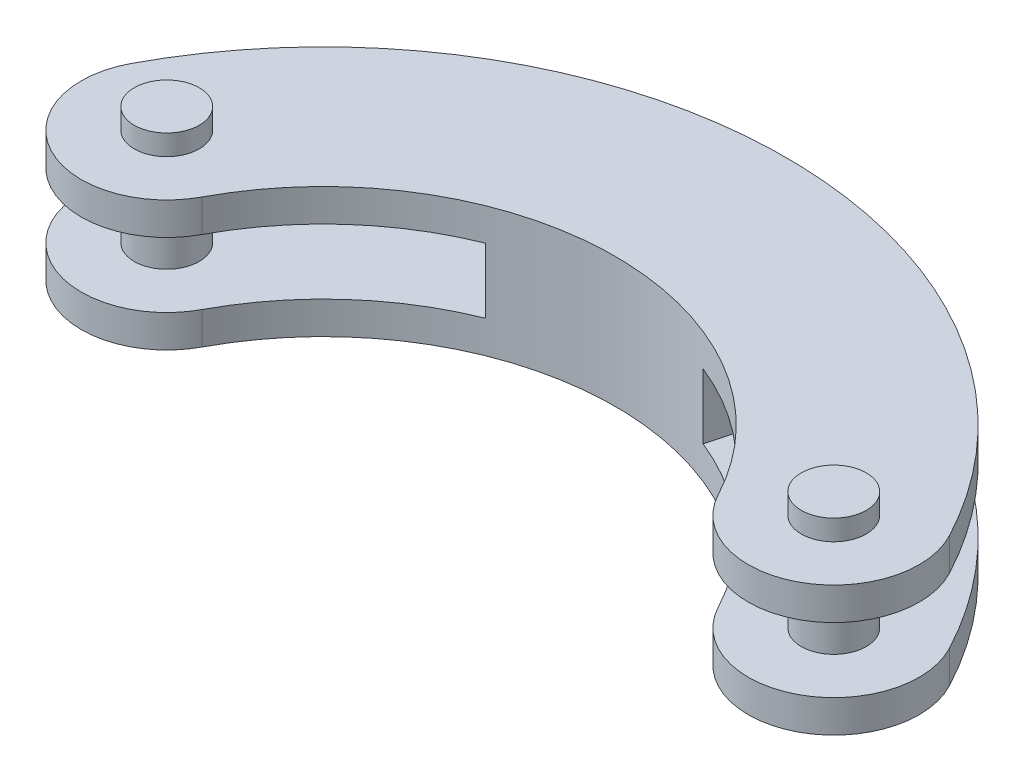
ISO-10303-21;
HEADER;
FILE_DESCRIPTION(('STEP AP214'),'2;1');
FILE_NAME('part.step','',(''),(''),'','','');
FILE_SCHEMA(('AUTOMOTIVE_DESIGN { 1 0 10303 214 1 1 1 1 }'));
ENDSEC;
DATA;
#1=APPLICATION_CONTEXT('core data for automotive mechanical design processes');
#2=APPLICATION_PROTOCOL_DEFINITION('international standard','automotive_design',2000,#1);
#3=PRODUCT_CONTEXT('',#1,'mechanical');
#4=PRODUCT('Part','Part','',(#3));
#5=PRODUCT_RELATED_PRODUCT_CATEGORY('part','',(#4));
#6=PRODUCT_DEFINITION_FORMATION('','',#4);
#7=PRODUCT_DEFINITION_CONTEXT('part definition',#1,'design');
#8=PRODUCT_DEFINITION('design','',#6,#7);
#9=PRODUCT_DEFINITION_SHAPE('','',#8);
#10=(LENGTH_UNIT() NAMED_UNIT(*) SI_UNIT(.MILLI.,.METRE.));
#11=(NAMED_UNIT(*) PLANE_ANGLE_UNIT() SI_UNIT($,.RADIAN.));
#12=(NAMED_UNIT(*) SI_UNIT($,.STERADIAN.) SOLID_ANGLE_UNIT());
#13=UNCERTAINTY_MEASURE_WITH_UNIT(LENGTH_MEASURE(1.E-05),#10,'distance_accuracy_value','');
#14=(GEOMETRIC_REPRESENTATION_CONTEXT(3) GLOBAL_UNCERTAINTY_ASSIGNED_CONTEXT((#13)) GLOBAL_UNIT_ASSIGNED_CONTEXT((#10,
#11,#12)) REPRESENTATION_CONTEXT('',''));
#15=CARTESIAN_POINT('',(0.,0.,0.));
#16=DIRECTION('',(0.,0.,1.));
#17=DIRECTION('',(1.,0.,0.));
#18=AXIS2_PLACEMENT_3D('',#15,#16,#17);
#19=CARTESIAN_POINT('',(48.75,9.5,84.5068861385762));
#20=DIRECTION('',(0.,1.,0.));
#21=DIRECTION('',(0.,0.,1.));
#22=AXIS2_PLACEMENT_3D('',#19,#20,#21);
#23=PLANE('',#22);
#24=CARTESIAN_POINT('',(-97.5,9.5,58.6208369333043));
#25=DIRECTION('',(0.,1.,0.));
#26=DIRECTION('',(0.,0.,1.));
#27=AXIS2_PLACEMENT_3D('',#24,#25,#26);
#28=CIRCLE('',#27,9.5);
#29=CARTESIAN_POINT('',(-97.5,9.5,68.1208369333043));
#30=VERTEX_POINT('',#29);
#31=EDGE_CURVE('E279',#30,#30,#28,.T.);
#32=ORIENTED_EDGE('',*,*,#31,.F.);
#33=EDGE_LOOP('',(#32));
#34=FACE_BOUND('',#33,.T.);
#35=CARTESIAN_POINT('',(0.,9.5,110.392935343848));
#36=DIRECTION('',(0.,-1.,0.));
#37=DIRECTION('',(0.,0.,1.));
#38=AXIS2_PLACEMENT_3D('',#35,#36,#37);
#39=CIRCLE('',#38,85.3929353438482);
#40=CARTESIAN_POINT('',(-75.4197827070386,9.5,70.3453413704057));
#41=VERTEX_POINT('',#40);
#42=CARTESIAN_POINT('',(-31.8432552720584,9.5,31.1593534462894));
#43=VERTEX_POINT('',#42);
#44=EDGE_CURVE('E60',#41,#43,#39,.T.);
#45=ORIENTED_EDGE('',*,*,#44,.T.);
#46=DIRECTION('',(-0.258819045102515,0.,-0.96592582628907));
#47=VECTOR('',#46,1.);
#48=CARTESIAN_POINT('',(-44.1456613988408,9.5,-14.7538512742104));
#49=LINE('',#48,#47);
#50=CARTESIAN_POINT('',(-44.8434517439362,9.5,-17.3580402951375));
#51=VERTEX_POINT('',#50);
#52=EDGE_CURVE('E153',#43,#51,#49,.T.);
#53=ORIENTED_EDGE('',*,*,#52,.T.);
#54=CARTESIAN_POINT('',(0.,9.5,110.392935343848));
#55=DIRECTION('',(0.,1.,0.));
#56=DIRECTION('',(0.,0.,1.));
#57=AXIS2_PLACEMENT_3D('',#54,#55,#56);
#58=CIRCLE('',#57,135.392935343848);
#59=CARTESIAN_POINT('',(-119.580217292961,9.5,46.8963324962029));
#60=VERTEX_POINT('',#59);
#61=EDGE_CURVE('E224',#51,#60,#58,.T.);
#62=ORIENTED_EDGE('',*,*,#61,.T.);
#63=CARTESIAN_POINT('',(-97.5,9.5,58.6208369333043));
#64=DIRECTION('',(0.,1.,0.));
#65=DIRECTION('',(0.,0.,1.));
#66=AXIS2_PLACEMENT_3D('',#63,#64,#65);
#67=CIRCLE('',#66,25.);
#68=EDGE_CURVE('E230',#60,#41,#67,.T.);
#69=ORIENTED_EDGE('',*,*,#68,.T.);
#70=EDGE_LOOP('',(#45,#53,#62,#69));
#71=FACE_BOUND('',#70,.T.);
#72=ADVANCED_FACE('F34',(#34,#71),#23,.T.);
#73=CARTESIAN_POINT('',(97.5,9.5,58.6208369333043));
#74=DIRECTION('',(0.,-1.,0.));
#75=DIRECTION('',(0.,0.,-1.));
#76=AXIS2_PLACEMENT_3D('',#73,#74,#75);
#77=CYLINDRICAL_SURFACE('',#76,25.);
#78=CARTESIAN_POINT('',(97.5,0.,58.6208369333043));
#79=DIRECTION('',(0.,1.,0.));
#80=DIRECTION('',(0.,0.,1.));
#81=AXIS2_PLACEMENT_3D('',#78,#79,#80);
#82=CIRCLE('',#81,25.);
#83=CARTESIAN_POINT('',(75.4197827070387,0.,70.3453413704057));
#84=VERTEX_POINT('',#83);
#85=CARTESIAN_POINT('',(119.580217292961,0.,46.8963324962029));
#86=VERTEX_POINT('',#85);
#87=EDGE_CURVE('E215',#84,#86,#82,.T.);
#88=ORIENTED_EDGE('',*,*,#87,.T.);
#89=DIRECTION('',(0.,-1.,0.));
#90=VECTOR('',#89,1.);
#91=CARTESIAN_POINT('',(119.580217292961,9.5,46.8963324962029));
#92=LINE('',#91,#90);
#93=CARTESIAN_POINT('',(119.580217292961,9.5,46.8963324962029));
#94=VERTEX_POINT('',#93);
#95=EDGE_CURVE('E11',#94,#86,#92,.T.);
#96=ORIENTED_EDGE('',*,*,#95,.F.);
#97=CARTESIAN_POINT('',(97.5,9.5,58.6208369333043));
#98=DIRECTION('',(0.,1.,0.));
#99=DIRECTION('',(0.,0.,1.));
#100=AXIS2_PLACEMENT_3D('',#97,#98,#99);
#101=CIRCLE('',#100,25.);
#102=CARTESIAN_POINT('',(75.4197827070387,9.5,70.3453413704057));
#103=VERTEX_POINT('',#102);
#104=EDGE_CURVE('E228',#103,#94,#101,.T.);
#105=ORIENTED_EDGE('',*,*,#104,.F.);
#106=DIRECTION('',(0.,-1.,0.));
#107=VECTOR('',#106,1.);
#108=CARTESIAN_POINT('',(75.4197827070387,9.5,70.3453413704057));
#109=LINE('',#108,#107);
#110=EDGE_CURVE('E248',#103,#84,#109,.T.);
#111=ORIENTED_EDGE('',*,*,#110,.T.);
#112=EDGE_LOOP('',(#88,#96,#105,#111));
#113=FACE_BOUND('',#112,.T.);
#114=ADVANCED_FACE('F36',(#113),#77,.T.);
#115=CARTESIAN_POINT('',(0.,9.5,110.392935343848));
#116=DIRECTION('',(0.,-1.,0.));
#117=DIRECTION('',(0.,0.,-1.));
#118=AXIS2_PLACEMENT_3D('',#115,#116,#117);
#119=CYLINDRICAL_SURFACE('',#118,135.392935343848);
#120=CARTESIAN_POINT('',(0.,0.,110.392935343848));
#121=DIRECTION('',(0.,1.,0.));
#122=DIRECTION('',(0.,0.,1.));
#123=AXIS2_PLACEMENT_3D('',#120,#121,#122);
#124=CIRCLE('',#123,135.392935343848);
#125=CARTESIAN_POINT('',(-119.580217292961,0.,46.8963324962029));
#126=VERTEX_POINT('',#125);
#127=EDGE_CURVE('E243',#86,#126,#124,.T.);
#128=ORIENTED_EDGE('',*,*,#127,.T.);
#129=DIRECTION('',(0.,-1.,0.));
#130=VECTOR('',#129,1.);
#131=CARTESIAN_POINT('',(-119.580217292961,9.5,46.8963324962029));
#132=LINE('',#131,#130);
#133=EDGE_CURVE('E44',#60,#126,#132,.T.);
#134=ORIENTED_EDGE('',*,*,#133,.F.);
#135=ORIENTED_EDGE('',*,*,#61,.F.);
#136=DIRECTION('',(0.,-1.,0.));
#137=VECTOR('',#136,1.);
#138=CARTESIAN_POINT('',(-44.8434517439362,28.5,-17.3580402951375));
#139=LINE('',#138,#137);
#140=CARTESIAN_POINT('',(-44.8434517439362,28.5,-17.3580402951375));
#141=VERTEX_POINT('',#140);
#142=EDGE_CURVE('E188',#141,#51,#139,.T.);
#143=ORIENTED_EDGE('',*,*,#142,.F.);
#144=CARTESIAN_POINT('',(0.,28.5,110.392935343848));
#145=DIRECTION('',(0.,1.,0.));
#146=DIRECTION('',(0.,0.,1.));
#147=AXIS2_PLACEMENT_3D('',#144,#145,#146);
#148=CIRCLE('',#147,135.392935343848);
#149=CARTESIAN_POINT('',(-119.580217292961,28.5,46.8963324962029));
#150=VERTEX_POINT('',#149);
#151=EDGE_CURVE('E183',#141,#150,#148,.T.);
#152=ORIENTED_EDGE('',*,*,#151,.T.);
#153=DIRECTION('',(0.,-1.,0.));
#154=VECTOR('',#153,1.);
#155=CARTESIAN_POINT('',(-119.580217292961,38.,46.8963324962029));
#156=LINE('',#155,#154);
#157=CARTESIAN_POINT('',(-119.580217292961,38.,46.8963324962029));
#158=VERTEX_POINT('',#157);
#159=EDGE_CURVE('E134',#158,#150,#156,.T.);
#160=ORIENTED_EDGE('',*,*,#159,.F.);
#161=CARTESIAN_POINT('',(0.,38.,110.392935343848));
#162=DIRECTION('',(0.,1.,0.));
#163=DIRECTION('',(0.,0.,1.));
#164=AXIS2_PLACEMENT_3D('',#161,#162,#163);
#165=CIRCLE('',#164,135.392935343848);
#166=CARTESIAN_POINT('',(119.580217292961,38.,46.8963324962029));
#167=VERTEX_POINT('',#166);
#168=EDGE_CURVE('E126',#167,#158,#165,.T.);
#169=ORIENTED_EDGE('',*,*,#168,.F.);
#170=DIRECTION('',(0.,-1.,0.));
#171=VECTOR('',#170,1.);
#172=CARTESIAN_POINT('',(119.580217292961,38.,46.8963324962029));
#173=LINE('',#172,#171);
#174=CARTESIAN_POINT('',(119.580217292961,28.5,46.8963324962029));
#175=VERTEX_POINT('',#174);
#176=EDGE_CURVE('E131',#167,#175,#173,.T.);
#177=ORIENTED_EDGE('',*,*,#176,.T.);
#178=CARTESIAN_POINT('',(44.8434517439363,28.5,-17.3580402951375));
#179=VERTEX_POINT('',#178);
#180=EDGE_CURVE('E274',#175,#179,#148,.T.);
#181=ORIENTED_EDGE('',*,*,#180,.T.);
#182=DIRECTION('',(0.,-1.,0.));
#183=VECTOR('',#182,1.);
#184=CARTESIAN_POINT('',(44.8434517439363,28.5,-17.3580402951375));
#185=LINE('',#184,#183);
#186=CARTESIAN_POINT('',(44.8434517439363,9.5,-17.3580402951375));
#187=VERTEX_POINT('',#186);
#188=EDGE_CURVE('E207',#179,#187,#185,.T.);
#189=ORIENTED_EDGE('',*,*,#188,.T.);
#190=EDGE_CURVE('E227',#94,#187,#58,.T.);
#191=ORIENTED_EDGE('',*,*,#190,.F.);
#192=ORIENTED_EDGE('',*,*,#95,.T.);
#193=EDGE_LOOP('',(#128,#134,#135,#143,#152,#160,#169,#177,#181,#189,#191,#192));
#194=FACE_BOUND('',#193,.T.);
#195=ADVANCED_FACE('F128',(#194),#119,.T.);
#196=CARTESIAN_POINT('',(-97.5,9.5,58.6208369333043));
#197=DIRECTION('',(0.,-1.,0.));
#198=DIRECTION('',(0.,0.,-1.));
#199=AXIS2_PLACEMENT_3D('',#196,#197,#198);
#200=CYLINDRICAL_SURFACE('',#199,25.);
#201=CARTESIAN_POINT('',(-97.5,0.,58.6208369333043));
#202=DIRECTION('',(0.,1.,0.));
#203=DIRECTION('',(0.,0.,1.));
#204=AXIS2_PLACEMENT_3D('',#201,#202,#203);
#205=CIRCLE('',#204,25.);
#206=CARTESIAN_POINT('',(-75.4197827070386,0.,70.3453413704057));
#207=VERTEX_POINT('',#206);
#208=EDGE_CURVE('E245',#126,#207,#205,.T.);
#209=ORIENTED_EDGE('',*,*,#208,.T.);
#210=DIRECTION('',(0.,-1.,0.));
#211=VECTOR('',#210,1.);
#212=CARTESIAN_POINT('',(-75.4197827070386,9.5,70.3453413704057));
#213=LINE('',#212,#211);
#214=EDGE_CURVE('E251',#41,#207,#213,.T.);
#215=ORIENTED_EDGE('',*,*,#214,.F.);
#216=ORIENTED_EDGE('',*,*,#68,.F.);
#217=ORIENTED_EDGE('',*,*,#133,.T.);
#218=EDGE_LOOP('',(#209,#215,#216,#217));
#219=FACE_BOUND('',#218,.T.);
#220=ADVANCED_FACE('F256',(#219),#200,.T.);
#221=CARTESIAN_POINT('',(0.,9.5,110.392935343848));
#222=DIRECTION('',(0.,-1.,0.));
#223=DIRECTION('',(0.,0.,-1.));
#224=AXIS2_PLACEMENT_3D('',#221,#222,#223);
#225=CYLINDRICAL_SURFACE('',#224,85.3929353438482);
#226=CARTESIAN_POINT('',(0.,0.,110.392935343848));
#227=DIRECTION('',(0.,-1.,0.));
#228=DIRECTION('',(0.,0.,1.));
#229=AXIS2_PLACEMENT_3D('',#226,#227,#228);
#230=CIRCLE('',#229,85.3929353438482);
#231=EDGE_CURVE('E233',#207,#84,#230,.T.);
#232=ORIENTED_EDGE('',*,*,#231,.T.);
#233=ORIENTED_EDGE('',*,*,#110,.F.);
#234=CARTESIAN_POINT('',(31.8432552720585,9.5,31.1593534462894));
#235=VERTEX_POINT('',#234);
#236=EDGE_CURVE('E204',#235,#103,#39,.T.);
#237=ORIENTED_EDGE('',*,*,#236,.F.);
#238=DIRECTION('',(0.,-1.,0.));
#239=VECTOR('',#238,1.);
#240=CARTESIAN_POINT('',(31.8432552720585,28.5,31.1593534462894));
#241=LINE('',#240,#239);
#242=CARTESIAN_POINT('',(31.8432552720585,28.5,31.1593534462894));
#243=VERTEX_POINT('',#242);
#244=EDGE_CURVE('E210',#243,#235,#241,.T.);
#245=ORIENTED_EDGE('',*,*,#244,.F.);
#246=CARTESIAN_POINT('',(0.,28.5,110.392935343848));
#247=DIRECTION('',(0.,-1.,0.));
#248=DIRECTION('',(0.,0.,1.));
#249=AXIS2_PLACEMENT_3D('',#246,#247,#248);
#250=CIRCLE('',#249,85.3929353438482);
#251=CARTESIAN_POINT('',(75.4197827070387,28.5,70.3453413704057));
#252=VERTEX_POINT('',#251);
#253=EDGE_CURVE('E162',#243,#252,#250,.T.);
#254=ORIENTED_EDGE('',*,*,#253,.T.);
#255=DIRECTION('',(0.,-1.,0.));
#256=VECTOR('',#255,1.);
#257=CARTESIAN_POINT('',(75.4197827070387,38.,70.3453413704057));
#258=LINE('',#257,#256);
#259=CARTESIAN_POINT('',(75.4197827070387,38.,70.3453413704057));
#260=VERTEX_POINT('',#259);
#261=EDGE_CURVE('E169',#260,#252,#258,.T.);
#262=ORIENTED_EDGE('',*,*,#261,.F.);
#263=CARTESIAN_POINT('',(0.,38.,110.392935343848));
#264=DIRECTION('',(0.,-1.,0.));
#265=DIRECTION('',(0.,0.,1.));
#266=AXIS2_PLACEMENT_3D('',#263,#264,#265);
#267=CIRCLE('',#266,85.3929353438482);
#268=CARTESIAN_POINT('',(-75.4197827070386,38.,70.3453413704057));
#269=VERTEX_POINT('',#268);
#270=EDGE_CURVE('E143',#269,#260,#267,.T.);
#271=ORIENTED_EDGE('',*,*,#270,.F.);
#272=DIRECTION('',(0.,-1.,0.));
#273=VECTOR('',#272,1.);
#274=CARTESIAN_POINT('',(-75.4197827070386,38.,70.3453413704057));
#275=LINE('',#274,#273);
#276=CARTESIAN_POINT('',(-75.4197827070386,28.5,70.3453413704057));
#277=VERTEX_POINT('',#276);
#278=EDGE_CURVE('E155',#269,#277,#275,.T.);
#279=ORIENTED_EDGE('',*,*,#278,.T.);
#280=CARTESIAN_POINT('',(-31.8432552720584,28.5,31.1593534462894));
#281=VERTEX_POINT('',#280);
#282=EDGE_CURVE('E147',#277,#281,#250,.T.);
#283=ORIENTED_EDGE('',*,*,#282,.T.);
#284=DIRECTION('',(0.,-1.,0.));
#285=VECTOR('',#284,1.);
#286=CARTESIAN_POINT('',(-31.8432552720584,28.5,31.1593534462894));
#287=LINE('',#286,#285);
#288=EDGE_CURVE('E187',#281,#43,#287,.T.);
#289=ORIENTED_EDGE('',*,*,#288,.T.);
#290=ORIENTED_EDGE('',*,*,#44,.F.);
#291=ORIENTED_EDGE('',*,*,#214,.T.);
#292=EDGE_LOOP('',(#232,#233,#237,#245,#254,#262,#271,#279,#283,#289,#290,#291));
#293=FACE_BOUND('',#292,.T.);
#294=ADVANCED_FACE('F175',(#293),#225,.F.);
#295=CARTESIAN_POINT('',(97.5,9.5,58.6208369333043));
#296=DIRECTION('',(0.,1.,0.));
#297=DIRECTION('',(0.,0.,1.));
#298=AXIS2_PLACEMENT_3D('',#295,#296,#297);
#299=CIRCLE('',#298,9.5);
#300=CARTESIAN_POINT('',(97.5,9.5,68.1208369333043));
#301=VERTEX_POINT('',#300);
#302=EDGE_CURVE('E287',#301,#301,#299,.T.);
#303=ORIENTED_EDGE('',*,*,#302,.F.);
#304=EDGE_LOOP('',(#303));
#305=FACE_BOUND('',#304,.T.);
#306=DIRECTION('',(0.258819045102514,0.,-0.96592582628907));
#307=VECTOR('',#306,1.);
#308=CARTESIAN_POINT('',(16.1991293678318,9.5,89.5440261608693));
#309=LINE('',#308,#307);
#310=EDGE_CURVE('E52',#235,#187,#309,.T.);
#311=ORIENTED_EDGE('',*,*,#310,.F.);
#312=ORIENTED_EDGE('',*,*,#236,.T.);
#313=ORIENTED_EDGE('',*,*,#104,.T.);
#314=ORIENTED_EDGE('',*,*,#190,.T.);
#315=EDGE_LOOP('',(#311,#312,#313,#314));
#316=FACE_BOUND('',#315,.T.);
#317=ADVANCED_FACE('F266',(#305,#316),#23,.T.);
#318=CARTESIAN_POINT('',(48.75,0.,84.5068861385762));
#319=DIRECTION('',(0.,1.,0.));
#320=DIRECTION('',(0.,0.,1.));
#321=AXIS2_PLACEMENT_3D('',#318,#319,#320);
#322=PLANE('',#321);
#323=CARTESIAN_POINT('',(97.5,0.,58.6208369333043));
#324=DIRECTION('',(0.,1.,0.));
#325=DIRECTION('',(0.,0.,1.));
#326=AXIS2_PLACEMENT_3D('',#323,#324,#325);
#327=CIRCLE('',#326,9.5);
#328=CARTESIAN_POINT('',(97.5,0.,68.1208369333043));
#329=VERTEX_POINT('',#328);
#330=EDGE_CURVE('E303',#329,#329,#327,.T.);
#331=ORIENTED_EDGE('',*,*,#330,.T.);
#332=EDGE_LOOP('',(#331));
#333=FACE_BOUND('',#332,.T.);
#334=CARTESIAN_POINT('',(-97.5,0.,58.6208369333043));
#335=DIRECTION('',(0.,1.,0.));
#336=DIRECTION('',(0.,0.,1.));
#337=AXIS2_PLACEMENT_3D('',#334,#335,#336);
#338=CIRCLE('',#337,9.5);
#339=CARTESIAN_POINT('',(-97.5,0.,68.1208369333043));
#340=VERTEX_POINT('',#339);
#341=EDGE_CURVE('E293',#340,#340,#338,.T.);
#342=ORIENTED_EDGE('',*,*,#341,.T.);
#343=EDGE_LOOP('',(#342));
#344=FACE_BOUND('',#343,.T.);
#345=ORIENTED_EDGE('',*,*,#87,.F.);
#346=ORIENTED_EDGE('',*,*,#231,.F.);
#347=ORIENTED_EDGE('',*,*,#208,.F.);
#348=ORIENTED_EDGE('',*,*,#127,.F.);
#349=EDGE_LOOP('',(#345,#346,#347,#348));
#350=FACE_BOUND('',#349,.T.);
#351=ADVANCED_FACE('F261',(#333,#344,#350),#322,.F.);
#352=CARTESIAN_POINT('',(16.1991293678318,28.5,89.5440261608693));
#353=DIRECTION('',(-0.96592582628907,0.,-0.258819045102514));
#354=DIRECTION('',(-0.258819045102514,0.,0.96592582628907));
#355=AXIS2_PLACEMENT_3D('',#352,#353,#354);
#356=PLANE('',#355);
#357=ORIENTED_EDGE('',*,*,#310,.T.);
#358=ORIENTED_EDGE('',*,*,#188,.F.);
#359=DIRECTION('',(0.258819045102514,0.,-0.96592582628907));
#360=VECTOR('',#359,1.);
#361=CARTESIAN_POINT('',(16.1991293678318,28.5,89.5440261608693));
#362=LINE('',#361,#360);
#363=EDGE_CURVE('E38',#243,#179,#362,.T.);
#364=ORIENTED_EDGE('',*,*,#363,.F.);
#365=ORIENTED_EDGE('',*,*,#244,.T.);
#366=EDGE_LOOP('',(#357,#358,#364,#365));
#367=FACE_BOUND('',#366,.T.);
#368=ADVANCED_FACE('F270',(#367),#356,.F.);
#369=CARTESIAN_POINT('',(-44.1456613988408,28.5,-14.7538512742104));
#370=DIRECTION('',(-0.96592582628907,0.,0.258819045102515));
#371=DIRECTION('',(0.258819045102515,0.,0.96592582628907));
#372=AXIS2_PLACEMENT_3D('',#369,#370,#371);
#373=PLANE('',#372);
#374=ORIENTED_EDGE('',*,*,#52,.F.);
#375=ORIENTED_EDGE('',*,*,#288,.F.);
#376=DIRECTION('',(-0.258819045102515,0.,-0.96592582628907));
#377=VECTOR('',#376,1.);
#378=CARTESIAN_POINT('',(-44.1456613988408,28.5,-14.7538512742104));
#379=LINE('',#378,#377);
#380=EDGE_CURVE('E182',#281,#141,#379,.T.);
#381=ORIENTED_EDGE('',*,*,#380,.T.);
#382=ORIENTED_EDGE('',*,*,#142,.T.);
#383=EDGE_LOOP('',(#374,#375,#381,#382));
#384=FACE_BOUND('',#383,.T.);
#385=ADVANCED_FACE('F221',(#384),#373,.T.);
#386=CARTESIAN_POINT('',(48.75,28.5,84.5068861385762));
#387=DIRECTION('',(0.,1.,0.));
#388=DIRECTION('',(0.,0.,1.));
#389=AXIS2_PLACEMENT_3D('',#386,#387,#388);
#390=PLANE('',#389);
#391=CARTESIAN_POINT('',(97.5,28.5,58.6208369333043));
#392=DIRECTION('',(0.,1.,0.));
#393=DIRECTION('',(0.,0.,1.));
#394=AXIS2_PLACEMENT_3D('',#391,#392,#393);
#395=CIRCLE('',#394,9.5);
#396=CARTESIAN_POINT('',(97.5,28.5,68.1208369333043));
#397=VERTEX_POINT('',#396);
#398=EDGE_CURVE('E308',#397,#397,#395,.T.);
#399=ORIENTED_EDGE('',*,*,#398,.T.);
#400=EDGE_LOOP('',(#399));
#401=FACE_BOUND('',#400,.T.);
#402=ORIENTED_EDGE('',*,*,#253,.F.);
#403=ORIENTED_EDGE('',*,*,#363,.T.);
#404=ORIENTED_EDGE('',*,*,#180,.F.);
#405=CARTESIAN_POINT('',(97.5,28.5,58.6208369333043));
#406=DIRECTION('',(0.,1.,0.));
#407=DIRECTION('',(0.,0.,1.));
#408=AXIS2_PLACEMENT_3D('',#405,#406,#407);
#409=CIRCLE('',#408,25.);
#410=EDGE_CURVE('E151',#252,#175,#409,.T.);
#411=ORIENTED_EDGE('',*,*,#410,.F.);
#412=EDGE_LOOP('',(#402,#403,#404,#411));
#413=FACE_BOUND('',#412,.T.);
#414=ADVANCED_FACE('F273',(#401,#413),#390,.F.);
#415=CARTESIAN_POINT('',(97.5,38.,58.6208369333043));
#416=DIRECTION('',(0.,-1.,0.));
#417=DIRECTION('',(0.,0.,-1.));
#418=AXIS2_PLACEMENT_3D('',#415,#416,#417);
#419=CYLINDRICAL_SURFACE('',#418,25.);
#420=ORIENTED_EDGE('',*,*,#410,.T.);
#421=ORIENTED_EDGE('',*,*,#176,.F.);
#422=CARTESIAN_POINT('',(97.5,38.,58.6208369333043));
#423=DIRECTION('',(0.,1.,0.));
#424=DIRECTION('',(0.,0.,1.));
#425=AXIS2_PLACEMENT_3D('',#422,#423,#424);
#426=CIRCLE('',#425,25.);
#427=EDGE_CURVE('E138',#260,#167,#426,.T.);
#428=ORIENTED_EDGE('',*,*,#427,.F.);
#429=ORIENTED_EDGE('',*,*,#261,.T.);
#430=EDGE_LOOP('',(#420,#421,#428,#429));
#431=FACE_BOUND('',#430,.T.);
#432=ADVANCED_FACE('F149',(#431),#419,.T.);
#433=CARTESIAN_POINT('',(-97.5,38.,58.6208369333043));
#434=DIRECTION('',(0.,-1.,0.));
#435=DIRECTION('',(0.,0.,-1.));
#436=AXIS2_PLACEMENT_3D('',#433,#434,#435);
#437=CYLINDRICAL_SURFACE('',#436,25.);
#438=CARTESIAN_POINT('',(-97.5,28.5,58.6208369333043));
#439=DIRECTION('',(0.,1.,0.));
#440=DIRECTION('',(0.,0.,1.));
#441=AXIS2_PLACEMENT_3D('',#438,#439,#440);
#442=CIRCLE('',#441,25.);
#443=EDGE_CURVE('E167',#150,#277,#442,.T.);
#444=ORIENTED_EDGE('',*,*,#443,.T.);
#445=ORIENTED_EDGE('',*,*,#278,.F.);
#446=CARTESIAN_POINT('',(-97.5,38.,58.6208369333043));
#447=DIRECTION('',(0.,1.,0.));
#448=DIRECTION('',(0.,0.,1.));
#449=AXIS2_PLACEMENT_3D('',#446,#447,#448);
#450=CIRCLE('',#449,25.);
#451=EDGE_CURVE('E137',#158,#269,#450,.T.);
#452=ORIENTED_EDGE('',*,*,#451,.F.);
#453=ORIENTED_EDGE('',*,*,#159,.T.);
#454=EDGE_LOOP('',(#444,#445,#452,#453));
#455=FACE_BOUND('',#454,.T.);
#456=ADVANCED_FACE('F360',(#455),#437,.T.);
#457=CARTESIAN_POINT('',(48.75,38.,84.5068861385762));
#458=DIRECTION('',(0.,1.,0.));
#459=DIRECTION('',(0.,0.,1.));
#460=AXIS2_PLACEMENT_3D('',#457,#458,#459);
#461=PLANE('',#460);
#462=CARTESIAN_POINT('',(97.5,38.,58.6208369333043));
#463=DIRECTION('',(0.,1.,0.));
#464=DIRECTION('',(0.,0.,1.));
#465=AXIS2_PLACEMENT_3D('',#462,#463,#464);
#466=CIRCLE('',#465,9.5);
#467=CARTESIAN_POINT('',(97.5,38.,68.1208369333043));
#468=VERTEX_POINT('',#467);
#469=EDGE_CURVE('E290',#468,#468,#466,.T.);
#470=ORIENTED_EDGE('',*,*,#469,.F.);
#471=EDGE_LOOP('',(#470));
#472=FACE_BOUND('',#471,.T.);
#473=CARTESIAN_POINT('',(-97.5,38.,58.6208369333043));
#474=DIRECTION('',(0.,1.,0.));
#475=DIRECTION('',(0.,0.,1.));
#476=AXIS2_PLACEMENT_3D('',#473,#474,#475);
#477=CIRCLE('',#476,9.5);
#478=CARTESIAN_POINT('',(-97.5,38.,68.1208369333043));
#479=VERTEX_POINT('',#478);
#480=EDGE_CURVE('E284',#479,#479,#477,.T.);
#481=ORIENTED_EDGE('',*,*,#480,.F.);
#482=EDGE_LOOP('',(#481));
#483=FACE_BOUND('',#482,.T.);
#484=ORIENTED_EDGE('',*,*,#427,.T.);
#485=ORIENTED_EDGE('',*,*,#168,.T.);
#486=ORIENTED_EDGE('',*,*,#451,.T.);
#487=ORIENTED_EDGE('',*,*,#270,.T.);
#488=EDGE_LOOP('',(#484,#485,#486,#487));
#489=FACE_BOUND('',#488,.T.);
#490=ADVANCED_FACE('F141',(#472,#483,#489),#461,.T.);
#491=CARTESIAN_POINT('',(-97.5,28.5,58.6208369333043));
#492=DIRECTION('',(0.,1.,0.));
#493=DIRECTION('',(0.,0.,1.));
#494=AXIS2_PLACEMENT_3D('',#491,#492,#493);
#495=CIRCLE('',#494,9.5);
#496=CARTESIAN_POINT('',(-97.5,28.5,68.1208369333043));
#497=VERTEX_POINT('',#496);
#498=EDGE_CURVE('E296',#497,#497,#495,.T.);
#499=ORIENTED_EDGE('',*,*,#498,.T.);
#500=EDGE_LOOP('',(#499));
#501=FACE_BOUND('',#500,.T.);
#502=ORIENTED_EDGE('',*,*,#380,.F.);
#503=ORIENTED_EDGE('',*,*,#282,.F.);
#504=ORIENTED_EDGE('',*,*,#443,.F.);
#505=ORIENTED_EDGE('',*,*,#151,.F.);
#506=EDGE_LOOP('',(#502,#503,#504,#505));
#507=FACE_BOUND('',#506,.T.);
#508=ADVANCED_FACE('F180',(#501,#507),#390,.F.);
#509=CARTESIAN_POINT('',(-97.5,-6.00000000000001,58.6208369333043));
#510=DIRECTION('',(0.,1.,0.));
#511=DIRECTION('',(0.,0.,1.));
#512=AXIS2_PLACEMENT_3D('',#509,#510,#511);
#513=CYLINDRICAL_SURFACE('',#512,9.5);
#514=ORIENTED_EDGE('',*,*,#31,.T.);
#515=EDGE_LOOP('',(#514));
#516=FACE_BOUND('',#515,.T.);
#517=ORIENTED_EDGE('',*,*,#498,.F.);
#518=EDGE_LOOP('',(#517));
#519=FACE_BOUND('',#518,.T.);
#520=ADVANCED_FACE('F366',(#516,#519),#513,.T.);
#521=CARTESIAN_POINT('',(-97.5,44.,58.6208369333043));
#522=DIRECTION('',(0.,1.,0.));
#523=DIRECTION('',(0.,0.,1.));
#524=AXIS2_PLACEMENT_3D('',#521,#522,#523);
#525=PLANE('',#524);
#526=CARTESIAN_POINT('',(-97.5,44.,58.6208369333043));
#527=DIRECTION('',(0.,1.,0.));
#528=DIRECTION('',(0.,0.,1.));
#529=AXIS2_PLACEMENT_3D('',#526,#527,#528);
#530=CIRCLE('',#529,9.5);
#531=CARTESIAN_POINT('',(-97.5,44.,68.1208369333043));
#532=VERTEX_POINT('',#531);
#533=EDGE_CURVE('E300',#532,#532,#530,.T.);
#534=ORIENTED_EDGE('',*,*,#533,.T.);
#535=EDGE_LOOP('',(#534));
#536=FACE_BOUND('',#535,.T.);
#537=ADVANCED_FACE('F372',(#536),#525,.T.);
#538=ORIENTED_EDGE('',*,*,#480,.T.);
#539=EDGE_LOOP('',(#538));
#540=FACE_BOUND('',#539,.T.);
#541=ORIENTED_EDGE('',*,*,#533,.F.);
#542=EDGE_LOOP('',(#541));
#543=FACE_BOUND('',#542,.T.);
#544=ADVANCED_FACE('F375',(#540,#543),#513,.T.);
#545=CARTESIAN_POINT('',(-97.5,-6.00000000000001,58.6208369333043));
#546=DIRECTION('',(0.,1.,0.));
#547=DIRECTION('',(0.,0.,1.));
#548=AXIS2_PLACEMENT_3D('',#545,#546,#547);
#549=CIRCLE('',#548,9.5);
#550=CARTESIAN_POINT('',(-97.5,-6.00000000000001,68.1208369333043));
#551=VERTEX_POINT('',#550);
#552=EDGE_CURVE('E299',#551,#551,#549,.T.);
#553=ORIENTED_EDGE('',*,*,#552,.T.);
#554=EDGE_LOOP('',(#553));
#555=FACE_BOUND('',#554,.T.);
#556=ORIENTED_EDGE('',*,*,#341,.F.);
#557=EDGE_LOOP('',(#556));
#558=FACE_BOUND('',#557,.T.);
#559=ADVANCED_FACE('F376',(#555,#558),#513,.T.);
#560=CARTESIAN_POINT('',(-97.5,-6.00000000000001,58.6208369333043));
#561=DIRECTION('',(0.,1.,0.));
#562=DIRECTION('',(0.,0.,1.));
#563=AXIS2_PLACEMENT_3D('',#560,#561,#562);
#564=PLANE('',#563);
#565=ORIENTED_EDGE('',*,*,#552,.F.);
#566=EDGE_LOOP('',(#565));
#567=FACE_BOUND('',#566,.T.);
#568=ADVANCED_FACE('F391',(#567),#564,.F.);
#569=CARTESIAN_POINT('',(97.5,44.,58.6208369333043));
#570=DIRECTION('',(0.,1.,0.));
#571=DIRECTION('',(0.,0.,1.));
#572=AXIS2_PLACEMENT_3D('',#569,#570,#571);
#573=PLANE('',#572);
#574=CARTESIAN_POINT('',(97.5,44.,58.6208369333043));
#575=DIRECTION('',(0.,1.,0.));
#576=DIRECTION('',(0.,0.,1.));
#577=AXIS2_PLACEMENT_3D('',#574,#575,#576);
#578=CIRCLE('',#577,9.5);
#579=CARTESIAN_POINT('',(97.5,44.,68.1208369333043));
#580=VERTEX_POINT('',#579);
#581=EDGE_CURVE('E312',#580,#580,#578,.T.);
#582=ORIENTED_EDGE('',*,*,#581,.T.);
#583=EDGE_LOOP('',(#582));
#584=FACE_BOUND('',#583,.T.);
#585=ADVANCED_FACE('F393',(#584),#573,.T.);
#586=CARTESIAN_POINT('',(97.5,-6.00000000000001,58.6208369333043));
#587=DIRECTION('',(0.,1.,0.));
#588=DIRECTION('',(0.,0.,1.));
#589=AXIS2_PLACEMENT_3D('',#586,#587,#588);
#590=CYLINDRICAL_SURFACE('',#589,9.5);
#591=ORIENTED_EDGE('',*,*,#469,.T.);
#592=EDGE_LOOP('',(#591));
#593=FACE_BOUND('',#592,.T.);
#594=ORIENTED_EDGE('',*,*,#581,.F.);
#595=EDGE_LOOP('',(#594));
#596=FACE_BOUND('',#595,.T.);
#597=ADVANCED_FACE('F329',(#593,#596),#590,.T.);
#598=ORIENTED_EDGE('',*,*,#302,.T.);
#599=EDGE_LOOP('',(#598));
#600=FACE_BOUND('',#599,.T.);
#601=ORIENTED_EDGE('',*,*,#398,.F.);
#602=EDGE_LOOP('',(#601));
#603=FACE_BOUND('',#602,.T.);
#604=ADVANCED_FACE('F327',(#600,#603),#590,.T.);
#605=CARTESIAN_POINT('',(97.5,-6.00000000000001,58.6208369333043));
#606=DIRECTION('',(0.,1.,0.));
#607=DIRECTION('',(0.,0.,1.));
#608=AXIS2_PLACEMENT_3D('',#605,#606,#607);
#609=CIRCLE('',#608,9.5);
#610=CARTESIAN_POINT('',(97.5,-6.00000000000001,68.1208369333043));
#611=VERTEX_POINT('',#610);
#612=EDGE_CURVE('E311',#611,#611,#609,.T.);
#613=ORIENTED_EDGE('',*,*,#612,.T.);
#614=EDGE_LOOP('',(#613));
#615=FACE_BOUND('',#614,.T.);
#616=ORIENTED_EDGE('',*,*,#330,.F.);
#617=EDGE_LOOP('',(#616));
#618=FACE_BOUND('',#617,.T.);
#619=ADVANCED_FACE('F318',(#615,#618),#590,.T.);
#620=CARTESIAN_POINT('',(97.5,-6.00000000000001,58.6208369333043));
#621=DIRECTION('',(0.,1.,0.));
#622=DIRECTION('',(0.,0.,1.));
#623=AXIS2_PLACEMENT_3D('',#620,#621,#622);
#624=PLANE('',#623);
#625=ORIENTED_EDGE('',*,*,#612,.F.);
#626=EDGE_LOOP('',(#625));
#627=FACE_BOUND('',#626,.T.);
#628=ADVANCED_FACE('F321',(#627),#624,.F.);
#629=CLOSED_SHELL('',(#72,#114,#195,#220,#294,#317,#351,#368,#385,#414,#432,#456,#490,#508,#520,
#537,#544,#559,#568,#585,#597,#604,#619,#628));
#630=MANIFOLD_SOLID_BREP('B2',#629);
#631=ADVANCED_BREP_SHAPE_REPRESENTATION('',(#18,#630),#14);
#632=SHAPE_DEFINITION_REPRESENTATION(#9,#631);
ENDSEC;
END-ISO-10303-21;
